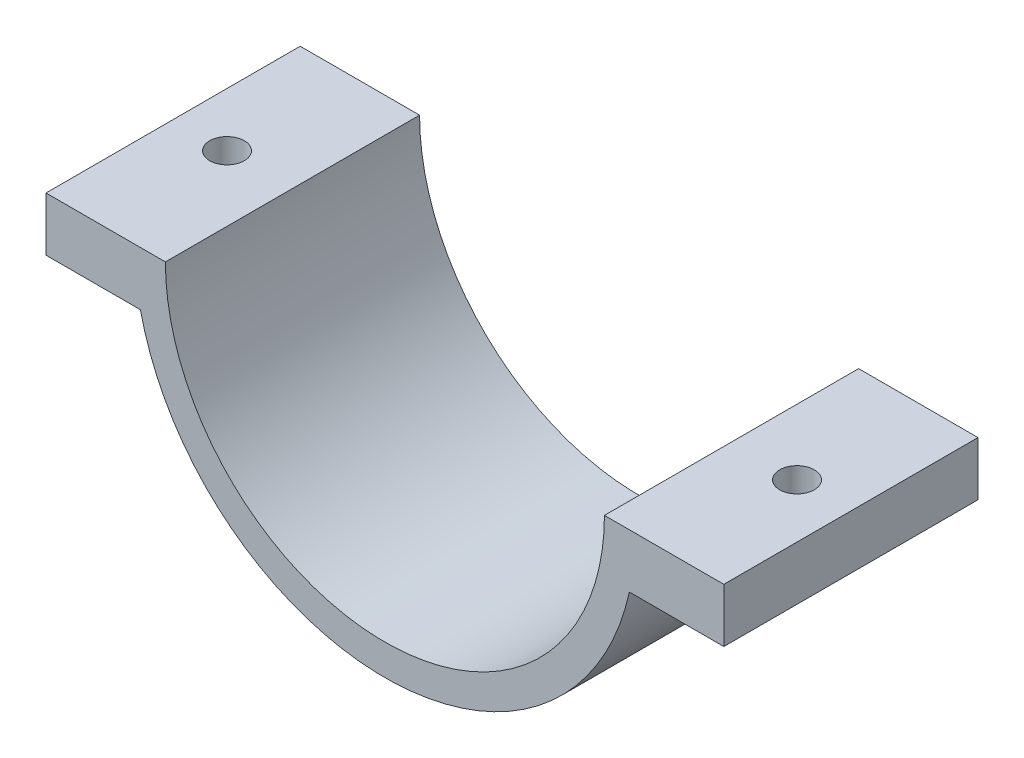
ISO-10303-21;
HEADER;
FILE_DESCRIPTION(('STEP AP214'),'2;1');
FILE_NAME('part.step','',(''),(''),'','','');
FILE_SCHEMA(('AUTOMOTIVE_DESIGN { 1 0 10303 214 1 1 1 1 }'));
ENDSEC;
DATA;
#1=APPLICATION_CONTEXT('core data for automotive mechanical design processes');
#2=APPLICATION_PROTOCOL_DEFINITION('international standard','automotive_design',2000,#1);
#3=PRODUCT_CONTEXT('',#1,'mechanical');
#4=PRODUCT('Part','Part','',(#3));
#5=PRODUCT_RELATED_PRODUCT_CATEGORY('part','',(#4));
#6=PRODUCT_DEFINITION_FORMATION('','',#4);
#7=PRODUCT_DEFINITION_CONTEXT('part definition',#1,'design');
#8=PRODUCT_DEFINITION('design','',#6,#7);
#9=PRODUCT_DEFINITION_SHAPE('','',#8);
#10=(LENGTH_UNIT() NAMED_UNIT(*) SI_UNIT(.MILLI.,.METRE.));
#11=(NAMED_UNIT(*) PLANE_ANGLE_UNIT() SI_UNIT($,.RADIAN.));
#12=(NAMED_UNIT(*) SI_UNIT($,.STERADIAN.) SOLID_ANGLE_UNIT());
#13=UNCERTAINTY_MEASURE_WITH_UNIT(LENGTH_MEASURE(1.E-05),#10,'distance_accuracy_value','');
#14=(GEOMETRIC_REPRESENTATION_CONTEXT(3) GLOBAL_UNCERTAINTY_ASSIGNED_CONTEXT((#13)) GLOBAL_UNIT_ASSIGNED_CONTEXT((#10,
#11,#12)) REPRESENTATION_CONTEXT('',''));
#15=CARTESIAN_POINT('',(0.,0.,0.));
#16=DIRECTION('',(0.,0.,1.));
#17=DIRECTION('',(1.,0.,0.));
#18=AXIS2_PLACEMENT_3D('',#15,#16,#17);
#19=CARTESIAN_POINT('',(-37.,-8.,16.5));
#20=DIRECTION('',(0.,1.,0.));
#21=DIRECTION('',(0.,0.,1.));
#22=AXIS2_PLACEMENT_3D('',#19,#20,#21);
#23=CYLINDRICAL_SURFACE('',#22,2.25);
#24=CARTESIAN_POINT('',(-37.,0.,16.5));
#25=DIRECTION('',(0.,1.,0.));
#26=DIRECTION('',(0.,0.,1.));
#27=AXIS2_PLACEMENT_3D('',#24,#25,#26);
#28=CIRCLE('',#27,2.25);
#29=CARTESIAN_POINT('',(-37.,0.,18.75));
#30=VERTEX_POINT('',#29);
#31=EDGE_CURVE('E9',#30,#30,#28,.T.);
#32=ORIENTED_EDGE('',*,*,#31,.T.);
#33=EDGE_LOOP('',(#32));
#34=FACE_BOUND('',#33,.T.);
#35=CARTESIAN_POINT('',(-37.,-7.,16.5));
#36=DIRECTION('',(0.,1.,0.));
#37=DIRECTION('',(0.,0.,1.));
#38=AXIS2_PLACEMENT_3D('',#35,#36,#37);
#39=CIRCLE('',#38,2.25);
#40=CARTESIAN_POINT('',(-37.,-7.,18.75));
#41=VERTEX_POINT('',#40);
#42=EDGE_CURVE('E181',#41,#41,#39,.T.);
#43=ORIENTED_EDGE('',*,*,#42,.F.);
#44=EDGE_LOOP('',(#43));
#45=FACE_BOUND('',#44,.T.);
#46=ADVANCED_FACE('F14',(#34,#45),#23,.F.);
#47=CARTESIAN_POINT('',(-44.,-7.,0.));
#48=DIRECTION('',(1.,0.,0.));
#49=DIRECTION('',(0.,1.,0.));
#50=AXIS2_PLACEMENT_3D('',#47,#48,#49);
#51=PLANE('',#50);
#52=DIRECTION('',(0.,1.,0.));
#53=VECTOR('',#52,1.);
#54=CARTESIAN_POINT('',(-44.,-7.,33.));
#55=LINE('',#54,#53);
#56=CARTESIAN_POINT('',(-44.,-7.,33.));
#57=VERTEX_POINT('',#56);
#58=CARTESIAN_POINT('',(-44.,0.,33.));
#59=VERTEX_POINT('',#58);
#60=EDGE_CURVE('E150',#57,#59,#55,.T.);
#61=ORIENTED_EDGE('',*,*,#60,.T.);
#62=DIRECTION('',(0.,0.,1.));
#63=VECTOR('',#62,1.);
#64=CARTESIAN_POINT('',(-44.,0.,0.));
#65=LINE('',#64,#63);
#66=CARTESIAN_POINT('',(-44.,0.,0.));
#67=VERTEX_POINT('',#66);
#68=EDGE_CURVE('E23',#67,#59,#65,.T.);
#69=ORIENTED_EDGE('',*,*,#68,.F.);
#70=DIRECTION('',(0.,1.,0.));
#71=VECTOR('',#70,1.);
#72=CARTESIAN_POINT('',(-44.,-7.,0.));
#73=LINE('',#72,#71);
#74=CARTESIAN_POINT('',(-44.,-7.,0.));
#75=VERTEX_POINT('',#74);
#76=EDGE_CURVE('E44',#75,#67,#73,.T.);
#77=ORIENTED_EDGE('',*,*,#76,.F.);
#78=DIRECTION('',(0.,0.,1.));
#79=VECTOR('',#78,1.);
#80=CARTESIAN_POINT('',(-44.,-7.,0.));
#81=LINE('',#80,#79);
#82=EDGE_CURVE('E182',#75,#57,#81,.T.);
#83=ORIENTED_EDGE('',*,*,#82,.T.);
#84=EDGE_LOOP('',(#61,#69,#77,#83));
#85=FACE_BOUND('',#84,.T.);
#86=ADVANCED_FACE('F16',(#85),#51,.F.);
#87=CARTESIAN_POINT('',(-44.,-7.,0.));
#88=DIRECTION('',(0.,1.,0.));
#89=DIRECTION('',(1.,0.,0.));
#90=AXIS2_PLACEMENT_3D('',#87,#88,#89);
#91=PLANE('',#90);
#92=ORIENTED_EDGE('',*,*,#42,.T.);
#93=EDGE_LOOP('',(#92));
#94=FACE_BOUND('',#93,.T.);
#95=DIRECTION('',(0.,0.,1.));
#96=VECTOR('',#95,1.);
#97=CARTESIAN_POINT('',(-31.73720214511,-7.,0.));
#98=LINE('',#97,#96);
#99=CARTESIAN_POINT('',(-31.73720214511,-7.,0.));
#100=VERTEX_POINT('',#99);
#101=CARTESIAN_POINT('',(-31.73720214511,-7.,33.));
#102=VERTEX_POINT('',#101);
#103=EDGE_CURVE('E146',#100,#102,#98,.T.);
#104=ORIENTED_EDGE('',*,*,#103,.T.);
#105=DIRECTION('',(1.,0.,0.));
#106=VECTOR('',#105,1.);
#107=CARTESIAN_POINT('',(-44.,-7.,33.));
#108=LINE('',#107,#106);
#109=EDGE_CURVE('E185',#57,#102,#108,.T.);
#110=ORIENTED_EDGE('',*,*,#109,.F.);
#111=ORIENTED_EDGE('',*,*,#82,.F.);
#112=DIRECTION('',(1.,0.,0.));
#113=VECTOR('',#112,1.);
#114=CARTESIAN_POINT('',(-44.,-7.,0.));
#115=LINE('',#114,#113);
#116=EDGE_CURVE('E178',#75,#100,#115,.T.);
#117=ORIENTED_EDGE('',*,*,#116,.T.);
#118=EDGE_LOOP('',(#104,#110,#111,#117));
#119=FACE_BOUND('',#118,.T.);
#120=ADVANCED_FACE('F329',(#94,#119),#91,.F.);
#121=CARTESIAN_POINT('',(30.,-7.,0.));
#122=DIRECTION('',(0.,1.,0.));
#123=DIRECTION('',(1.,0.,0.));
#124=AXIS2_PLACEMENT_3D('',#121,#122,#123);
#125=PLANE('',#124);
#126=CARTESIAN_POINT('',(37.,-7.,16.5));
#127=DIRECTION('',(0.,1.,0.));
#128=DIRECTION('',(0.,0.,1.));
#129=AXIS2_PLACEMENT_3D('',#126,#127,#128);
#130=CIRCLE('',#129,2.25);
#131=CARTESIAN_POINT('',(37.,-7.,18.75));
#132=VERTEX_POINT('',#131);
#133=EDGE_CURVE('E174',#132,#132,#130,.T.);
#134=ORIENTED_EDGE('',*,*,#133,.T.);
#135=EDGE_LOOP('',(#134));
#136=FACE_BOUND('',#135,.T.);
#137=DIRECTION('',(0.,0.,1.));
#138=VECTOR('',#137,1.);
#139=CARTESIAN_POINT('',(44.,-7.,0.));
#140=LINE('',#139,#138);
#141=CARTESIAN_POINT('',(44.,-7.,0.));
#142=VERTEX_POINT('',#141);
#143=CARTESIAN_POINT('',(44.,-7.,33.));
#144=VERTEX_POINT('',#143);
#145=EDGE_CURVE('E171',#142,#144,#140,.T.);
#146=ORIENTED_EDGE('',*,*,#145,.T.);
#147=DIRECTION('',(1.,0.,0.));
#148=VECTOR('',#147,1.);
#149=CARTESIAN_POINT('',(30.,-7.,33.));
#150=LINE('',#149,#148);
#151=CARTESIAN_POINT('',(31.737202145116,-7.000000000001,33.));
#152=VERTEX_POINT('',#151);
#153=EDGE_CURVE('E123',#152,#144,#150,.T.);
#154=ORIENTED_EDGE('',*,*,#153,.F.);
#155=DIRECTION('',(0.,0.,1.));
#156=VECTOR('',#155,1.);
#157=CARTESIAN_POINT('',(31.737202145117,-7.,0.));
#158=LINE('',#157,#156);
#159=CARTESIAN_POINT('',(31.737202145116,-7.000000000001,0.));
#160=VERTEX_POINT('',#159);
#161=EDGE_CURVE('E151',#160,#152,#158,.T.);
#162=ORIENTED_EDGE('',*,*,#161,.F.);
#163=DIRECTION('',(1.,0.,0.));
#164=VECTOR('',#163,1.);
#165=CARTESIAN_POINT('',(30.,-7.,0.));
#166=LINE('',#165,#164);
#167=EDGE_CURVE('E167',#160,#142,#166,.T.);
#168=ORIENTED_EDGE('',*,*,#167,.T.);
#169=EDGE_LOOP('',(#146,#154,#162,#168));
#170=FACE_BOUND('',#169,.T.);
#171=ADVANCED_FACE('F319',(#136,#170),#125,.F.);
#172=CARTESIAN_POINT('',(0.,0.,0.));
#173=DIRECTION('',(0.,0.,1.));
#174=DIRECTION('',(1.,0.,0.));
#175=AXIS2_PLACEMENT_3D('',#172,#173,#174);
#176=CYLINDRICAL_SURFACE('',#175,32.5);
#177=ORIENTED_EDGE('',*,*,#161,.T.);
#178=CARTESIAN_POINT('',(0.,0.,33.));
#179=DIRECTION('',(0.,0.,1.));
#180=DIRECTION('',(1.,0.,0.));
#181=AXIS2_PLACEMENT_3D('',#178,#179,#180);
#182=CIRCLE('',#181,32.5);
#183=EDGE_CURVE('E139',#102,#152,#182,.T.);
#184=ORIENTED_EDGE('',*,*,#183,.F.);
#185=ORIENTED_EDGE('',*,*,#103,.F.);
#186=CARTESIAN_POINT('',(0.,0.,0.));
#187=DIRECTION('',(0.,0.,1.));
#188=DIRECTION('',(1.,0.,0.));
#189=AXIS2_PLACEMENT_3D('',#186,#187,#188);
#190=CIRCLE('',#189,32.5);
#191=EDGE_CURVE('E163',#100,#160,#190,.T.);
#192=ORIENTED_EDGE('',*,*,#191,.T.);
#193=EDGE_LOOP('',(#177,#184,#185,#192));
#194=FACE_BOUND('',#193,.T.);
#195=ADVANCED_FACE('F309',(#194),#176,.T.);
#196=CARTESIAN_POINT('',(-45.,0.,-1.));
#197=DIRECTION('',(0.,1.,0.));
#198=DIRECTION('',(1.,0.,0.));
#199=AXIS2_PLACEMENT_3D('',#196,#197,#198);
#200=PLANE('',#199);
#201=DIRECTION('',(0.,0.,1.));
#202=VECTOR('',#201,1.);
#203=CARTESIAN_POINT('',(-28.5,0.,-1.));
#204=LINE('',#203,#202);
#205=CARTESIAN_POINT('',(-28.5,0.,0.));
#206=VERTEX_POINT('',#205);
#207=CARTESIAN_POINT('',(-28.5,0.,33.));
#208=VERTEX_POINT('',#207);
#209=EDGE_CURVE('E144',#206,#208,#204,.T.);
#210=ORIENTED_EDGE('',*,*,#209,.F.);
#211=DIRECTION('',(-1.,0.,0.));
#212=VECTOR('',#211,1.);
#213=CARTESIAN_POINT('',(-22.5,0.,0.));
#214=LINE('',#213,#212);
#215=EDGE_CURVE('E35',#206,#67,#214,.T.);
#216=ORIENTED_EDGE('',*,*,#215,.T.);
#217=ORIENTED_EDGE('',*,*,#68,.T.);
#218=DIRECTION('',(-1.,0.,0.));
#219=VECTOR('',#218,1.);
#220=CARTESIAN_POINT('',(-22.5,0.,33.));
#221=LINE('',#220,#219);
#222=EDGE_CURVE('E157',#208,#59,#221,.T.);
#223=ORIENTED_EDGE('',*,*,#222,.F.);
#224=EDGE_LOOP('',(#210,#216,#217,#223));
#225=FACE_BOUND('',#224,.T.);
#226=ORIENTED_EDGE('',*,*,#31,.F.);
#227=EDGE_LOOP('',(#226));
#228=FACE_BOUND('',#227,.T.);
#229=ADVANCED_FACE('F196',(#225,#228),#200,.T.);
#230=CARTESIAN_POINT('',(37.,-8.,16.5));
#231=DIRECTION('',(0.,1.,0.));
#232=DIRECTION('',(0.,0.,1.));
#233=AXIS2_PLACEMENT_3D('',#230,#231,#232);
#234=CYLINDRICAL_SURFACE('',#233,2.25);
#235=CARTESIAN_POINT('',(37.,0.,16.5));
#236=DIRECTION('',(0.,1.,0.));
#237=DIRECTION('',(0.,0.,1.));
#238=AXIS2_PLACEMENT_3D('',#235,#236,#237);
#239=CIRCLE('',#238,2.25);
#240=CARTESIAN_POINT('',(37.,0.,18.75));
#241=VERTEX_POINT('',#240);
#242=EDGE_CURVE('E133',#241,#241,#239,.T.);
#243=ORIENTED_EDGE('',*,*,#242,.T.);
#244=EDGE_LOOP('',(#243));
#245=FACE_BOUND('',#244,.T.);
#246=ORIENTED_EDGE('',*,*,#133,.F.);
#247=EDGE_LOOP('',(#246));
#248=FACE_BOUND('',#247,.T.);
#249=ADVANCED_FACE('F288',(#245,#248),#234,.F.);
#250=CARTESIAN_POINT('',(44.,-7.,0.));
#251=DIRECTION('',(1.,0.,0.));
#252=DIRECTION('',(0.,1.,0.));
#253=AXIS2_PLACEMENT_3D('',#250,#251,#252);
#254=PLANE('',#253);
#255=ORIENTED_EDGE('',*,*,#145,.F.);
#256=DIRECTION('',(0.,1.,0.));
#257=VECTOR('',#256,1.);
#258=CARTESIAN_POINT('',(44.,-7.,0.));
#259=LINE('',#258,#257);
#260=CARTESIAN_POINT('',(44.,0.,0.));
#261=VERTEX_POINT('',#260);
#262=EDGE_CURVE('E131',#142,#261,#259,.T.);
#263=ORIENTED_EDGE('',*,*,#262,.T.);
#264=DIRECTION('',(0.,0.,1.));
#265=VECTOR('',#264,1.);
#266=CARTESIAN_POINT('',(44.,0.,0.));
#267=LINE('',#266,#265);
#268=CARTESIAN_POINT('',(44.,0.,33.));
#269=VERTEX_POINT('',#268);
#270=EDGE_CURVE('E108',#261,#269,#267,.T.);
#271=ORIENTED_EDGE('',*,*,#270,.T.);
#272=DIRECTION('',(0.,1.,0.));
#273=VECTOR('',#272,1.);
#274=CARTESIAN_POINT('',(44.,-7.,33.));
#275=LINE('',#274,#273);
#276=EDGE_CURVE('E119',#144,#269,#275,.T.);
#277=ORIENTED_EDGE('',*,*,#276,.F.);
#278=EDGE_LOOP('',(#255,#263,#271,#277));
#279=FACE_BOUND('',#278,.T.);
#280=ADVANCED_FACE('F129',(#279),#254,.T.);
#281=CARTESIAN_POINT('',(0.,0.,-1.));
#282=DIRECTION('',(0.,0.,1.));
#283=DIRECTION('',(1.,0.,0.));
#284=AXIS2_PLACEMENT_3D('',#281,#282,#283);
#285=CYLINDRICAL_SURFACE('',#284,28.5);
#286=CARTESIAN_POINT('',(0.,0.,0.));
#287=DIRECTION('',(0.,0.,1.));
#288=DIRECTION('',(1.,0.,0.));
#289=AXIS2_PLACEMENT_3D('',#286,#287,#288);
#290=CIRCLE('',#289,28.5);
#291=CARTESIAN_POINT('',(28.5,0.,0.));
#292=VERTEX_POINT('',#291);
#293=EDGE_CURVE('E126',#206,#292,#290,.T.);
#294=ORIENTED_EDGE('',*,*,#293,.F.);
#295=ORIENTED_EDGE('',*,*,#209,.T.);
#296=CARTESIAN_POINT('',(0.,0.,33.));
#297=DIRECTION('',(0.,0.,1.));
#298=DIRECTION('',(1.,0.,0.));
#299=AXIS2_PLACEMENT_3D('',#296,#297,#298);
#300=CIRCLE('',#299,28.5);
#301=CARTESIAN_POINT('',(28.5,0.,33.));
#302=VERTEX_POINT('',#301);
#303=EDGE_CURVE('E154',#208,#302,#300,.T.);
#304=ORIENTED_EDGE('',*,*,#303,.T.);
#305=DIRECTION('',(0.,0.,1.));
#306=VECTOR('',#305,1.);
#307=CARTESIAN_POINT('',(28.5,0.,-1.));
#308=LINE('',#307,#306);
#309=EDGE_CURVE('E110',#292,#302,#308,.T.);
#310=ORIENTED_EDGE('',*,*,#309,.F.);
#311=EDGE_LOOP('',(#294,#295,#304,#310));
#312=FACE_BOUND('',#311,.T.);
#313=ADVANCED_FACE('F266',(#312),#285,.F.);
#314=CARTESIAN_POINT('',(0.,0.,0.));
#315=DIRECTION('',(0.,0.,1.));
#316=DIRECTION('',(1.,0.,0.));
#317=AXIS2_PLACEMENT_3D('',#314,#315,#316);
#318=PLANE('',#317);
#319=ORIENTED_EDGE('',*,*,#293,.T.);
#320=DIRECTION('',(-1.,0.,0.));
#321=VECTOR('',#320,1.);
#322=CARTESIAN_POINT('',(-22.5,0.,0.));
#323=LINE('',#322,#321);
#324=EDGE_CURVE('E115',#261,#292,#323,.T.);
#325=ORIENTED_EDGE('',*,*,#324,.F.);
#326=ORIENTED_EDGE('',*,*,#262,.F.);
#327=ORIENTED_EDGE('',*,*,#167,.F.);
#328=ORIENTED_EDGE('',*,*,#191,.F.);
#329=ORIENTED_EDGE('',*,*,#116,.F.);
#330=ORIENTED_EDGE('',*,*,#76,.T.);
#331=ORIENTED_EDGE('',*,*,#215,.F.);
#332=EDGE_LOOP('',(#319,#325,#326,#327,#328,#329,#330,#331));
#333=FACE_BOUND('',#332,.T.);
#334=ADVANCED_FACE('F256',(#333),#318,.F.);
#335=CARTESIAN_POINT('',(0.,0.,33.));
#336=DIRECTION('',(0.,0.,1.));
#337=DIRECTION('',(1.,0.,0.));
#338=AXIS2_PLACEMENT_3D('',#335,#336,#337);
#339=PLANE('',#338);
#340=ORIENTED_EDGE('',*,*,#183,.T.);
#341=ORIENTED_EDGE('',*,*,#153,.T.);
#342=ORIENTED_EDGE('',*,*,#276,.T.);
#343=DIRECTION('',(-1.,0.,0.));
#344=VECTOR('',#343,1.);
#345=CARTESIAN_POINT('',(-22.5,0.,33.));
#346=LINE('',#345,#344);
#347=EDGE_CURVE('E103',#269,#302,#346,.T.);
#348=ORIENTED_EDGE('',*,*,#347,.T.);
#349=ORIENTED_EDGE('',*,*,#303,.F.);
#350=ORIENTED_EDGE('',*,*,#222,.T.);
#351=ORIENTED_EDGE('',*,*,#60,.F.);
#352=ORIENTED_EDGE('',*,*,#109,.T.);
#353=EDGE_LOOP('',(#340,#341,#342,#348,#349,#350,#351,#352));
#354=FACE_BOUND('',#353,.T.);
#355=ADVANCED_FACE('F121',(#354),#339,.T.);
#356=CARTESIAN_POINT('',(-45.,0.,-1.));
#357=DIRECTION('',(0.,1.,0.));
#358=DIRECTION('',(1.,0.,0.));
#359=AXIS2_PLACEMENT_3D('',#356,#357,#358);
#360=PLANE('',#359);
#361=ORIENTED_EDGE('',*,*,#347,.F.);
#362=ORIENTED_EDGE('',*,*,#270,.F.);
#363=ORIENTED_EDGE('',*,*,#324,.T.);
#364=ORIENTED_EDGE('',*,*,#309,.T.);
#365=EDGE_LOOP('',(#361,#362,#363,#364));
#366=FACE_BOUND('',#365,.T.);
#367=ORIENTED_EDGE('',*,*,#242,.F.);
#368=EDGE_LOOP('',(#367));
#369=FACE_BOUND('',#368,.T.);
#370=ADVANCED_FACE('F105',(#366,#369),#360,.T.);
#371=CLOSED_SHELL('',(#46,#86,#120,#171,#195,#229,#249,#280,#313,#334,#355,#370));
#372=MANIFOLD_SOLID_BREP('B1',#371);
#373=ADVANCED_BREP_SHAPE_REPRESENTATION('',(#18,#372),#14);
#374=SHAPE_DEFINITION_REPRESENTATION(#9,#373);
ENDSEC;
END-ISO-10303-21;
